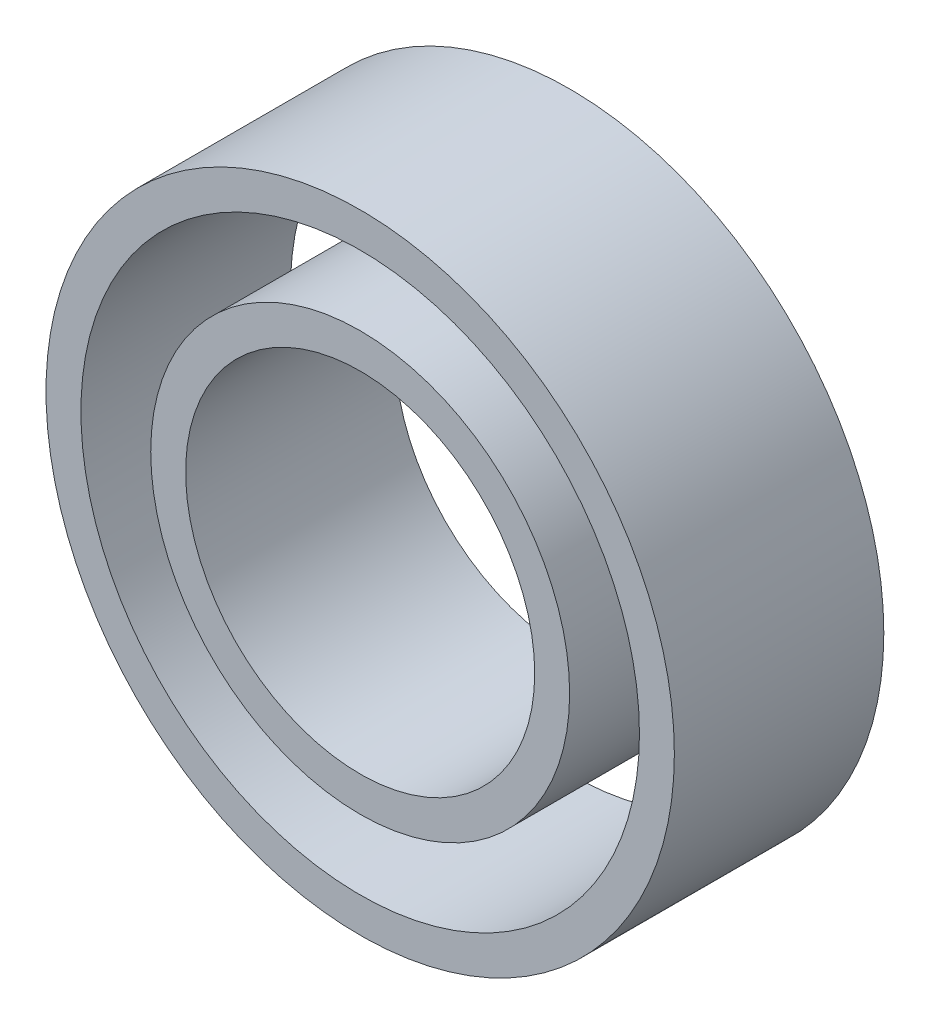
ISO-10303-21;
HEADER;
FILE_DESCRIPTION(('STEP AP214'),'2;1');
FILE_NAME('part.step','',(''),(''),'','','');
FILE_SCHEMA(('AUTOMOTIVE_DESIGN { 1 0 10303 214 1 1 1 1 }'));
ENDSEC;
DATA;
#1=APPLICATION_CONTEXT('core data for automotive mechanical design processes');
#2=APPLICATION_PROTOCOL_DEFINITION('international standard','automotive_design',2000,#1);
#3=PRODUCT_CONTEXT('',#1,'mechanical');
#4=PRODUCT('Part','Part','',(#3));
#5=PRODUCT_RELATED_PRODUCT_CATEGORY('part','',(#4));
#6=PRODUCT_DEFINITION_FORMATION('','',#4);
#7=PRODUCT_DEFINITION_CONTEXT('part definition',#1,'design');
#8=PRODUCT_DEFINITION('design','',#6,#7);
#9=PRODUCT_DEFINITION_SHAPE('','',#8);
#10=(LENGTH_UNIT() NAMED_UNIT(*) SI_UNIT(.MILLI.,.METRE.));
#11=(NAMED_UNIT(*) PLANE_ANGLE_UNIT() SI_UNIT($,.RADIAN.));
#12=(NAMED_UNIT(*) SI_UNIT($,.STERADIAN.) SOLID_ANGLE_UNIT());
#13=UNCERTAINTY_MEASURE_WITH_UNIT(LENGTH_MEASURE(1.E-05),#10,'distance_accuracy_value','');
#14=(GEOMETRIC_REPRESENTATION_CONTEXT(3) GLOBAL_UNCERTAINTY_ASSIGNED_CONTEXT((#13)) GLOBAL_UNIT_ASSIGNED_CONTEXT((#10,
#11,#12)) REPRESENTATION_CONTEXT('',''));
#15=CARTESIAN_POINT('',(0.,0.,0.));
#16=DIRECTION('',(0.,0.,1.));
#17=DIRECTION('',(1.,0.,0.));
#18=AXIS2_PLACEMENT_3D('',#15,#16,#17);
#19=CARTESIAN_POINT('',(0.,0.,-2.5));
#20=DIRECTION('',(0.,0.,1.));
#21=DIRECTION('',(1.,0.,0.));
#22=AXIS2_PLACEMENT_3D('',#19,#20,#21);
#23=CYLINDRICAL_SURFACE('',#22,4.);
#24=CARTESIAN_POINT('',(0.,0.,-4.));
#25=DIRECTION('',(0.,0.,1.));
#26=DIRECTION('',(1.,0.,0.));
#27=AXIS2_PLACEMENT_3D('',#24,#25,#26);
#28=CIRCLE('',#27,4.);
#29=CARTESIAN_POINT('',(4.,0.,-4.));
#30=VERTEX_POINT('',#29);
#31=EDGE_CURVE('P0_E27',#30,#30,#28,.T.);
#32=ORIENTED_EDGE('',*,*,#31,.F.);
#33=EDGE_LOOP('',(#32));
#34=FACE_BOUND('',#33,.T.);
#35=CARTESIAN_POINT('',(0.,0.,-1.));
#36=DIRECTION('',(0.,0.,1.));
#37=DIRECTION('',(1.,0.,0.));
#38=AXIS2_PLACEMENT_3D('',#35,#36,#37);
#39=CIRCLE('',#38,4.);
#40=CARTESIAN_POINT('',(4.,0.,-1.));
#41=VERTEX_POINT('',#40);
#42=EDGE_CURVE('P0_E18',#41,#41,#39,.F.);
#43=ORIENTED_EDGE('',*,*,#42,.F.);
#44=EDGE_LOOP('',(#43));
#45=FACE_BOUND('',#44,.T.);
#46=ADVANCED_FACE('P0_F15',(#34,#45),#23,.F.);
#47=CARTESIAN_POINT('',(4.,0.,-1.));
#48=DIRECTION('',(0.,0.,1.));
#49=DIRECTION('',(1.,0.,0.));
#50=AXIS2_PLACEMENT_3D('',#47,#48,#49);
#51=PLANE('',#50);
#52=ORIENTED_EDGE('',*,*,#42,.T.);
#53=EDGE_LOOP('',(#52));
#54=FACE_BOUND('',#53,.T.);
#55=CARTESIAN_POINT('',(0.,0.,-1.));
#56=DIRECTION('',(0.,0.,1.));
#57=DIRECTION('',(1.,0.,0.));
#58=AXIS2_PLACEMENT_3D('',#55,#56,#57);
#59=CIRCLE('',#58,4.5);
#60=CARTESIAN_POINT('',(4.5,0.,-1.));
#61=VERTEX_POINT('',#60);
#62=EDGE_CURVE('P0_E22',#61,#61,#59,.F.);
#63=ORIENTED_EDGE('',*,*,#62,.F.);
#64=EDGE_LOOP('',(#63));
#65=FACE_BOUND('',#64,.T.);
#66=ADVANCED_FACE('P0_F35',(#54,#65),#51,.T.);
#67=CARTESIAN_POINT('',(4.5,0.,-4.));
#68=DIRECTION('',(0.,0.,-1.));
#69=DIRECTION('',(-1.,0.,0.));
#70=AXIS2_PLACEMENT_3D('',#67,#68,#69);
#71=PLANE('',#70);
#72=ORIENTED_EDGE('',*,*,#31,.T.);
#73=EDGE_LOOP('',(#72));
#74=FACE_BOUND('',#73,.T.);
#75=CARTESIAN_POINT('',(0.,0.,-4.));
#76=DIRECTION('',(0.,0.,1.));
#77=DIRECTION('',(1.,0.,0.));
#78=AXIS2_PLACEMENT_3D('',#75,#76,#77);
#79=CIRCLE('',#78,4.5);
#80=CARTESIAN_POINT('',(4.5,0.,-4.));
#81=VERTEX_POINT('',#80);
#82=EDGE_CURVE('P0_E10',#81,#81,#79,.T.);
#83=ORIENTED_EDGE('',*,*,#82,.F.);
#84=EDGE_LOOP('',(#83));
#85=FACE_BOUND('',#84,.T.);
#86=ADVANCED_FACE('P0_F44',(#74,#85),#71,.T.);
#87=CARTESIAN_POINT('',(0.,0.,-2.5));
#88=DIRECTION('',(0.,0.,1.));
#89=DIRECTION('',(1.,0.,0.));
#90=AXIS2_PLACEMENT_3D('',#87,#88,#89);
#91=CYLINDRICAL_SURFACE('',#90,4.5);
#92=ORIENTED_EDGE('',*,*,#82,.T.);
#93=EDGE_LOOP('',(#92));
#94=FACE_BOUND('',#93,.T.);
#95=ORIENTED_EDGE('',*,*,#62,.T.);
#96=EDGE_LOOP('',(#95));
#97=FACE_BOUND('',#96,.T.);
#98=ADVANCED_FACE('P0_F45',(#94,#97),#91,.T.);
#99=CLOSED_SHELL('',(#46,#66,#86,#98));
#100=MANIFOLD_SOLID_BREP('P0_B1',#99);
#101=CARTESIAN_POINT('',(0.,0.,-2.5));
#102=DIRECTION('',(0.,0.,1.));
#103=DIRECTION('',(1.,0.,0.));
#104=AXIS2_PLACEMENT_3D('',#101,#102,#103);
#105=CYLINDRICAL_SURFACE('',#104,2.5);
#106=CARTESIAN_POINT('',(0.,0.,-4.));
#107=DIRECTION('',(0.,0.,1.));
#108=DIRECTION('',(1.,0.,0.));
#109=AXIS2_PLACEMENT_3D('',#106,#107,#108);
#110=CIRCLE('',#109,2.5);
#111=CARTESIAN_POINT('',(2.5,0.,-4.));
#112=VERTEX_POINT('',#111);
#113=EDGE_CURVE('P1_E27',#112,#112,#110,.T.);
#114=ORIENTED_EDGE('',*,*,#113,.F.);
#115=EDGE_LOOP('',(#114));
#116=FACE_BOUND('',#115,.T.);
#117=CARTESIAN_POINT('',(0.,0.,-1.));
#118=DIRECTION('',(0.,0.,1.));
#119=DIRECTION('',(1.,0.,0.));
#120=AXIS2_PLACEMENT_3D('',#117,#118,#119);
#121=CIRCLE('',#120,2.5);
#122=CARTESIAN_POINT('',(2.5,0.,-1.));
#123=VERTEX_POINT('',#122);
#124=EDGE_CURVE('P1_E18',#123,#123,#121,.F.);
#125=ORIENTED_EDGE('',*,*,#124,.F.);
#126=EDGE_LOOP('',(#125));
#127=FACE_BOUND('',#126,.T.);
#128=ADVANCED_FACE('P1_F15',(#116,#127),#105,.F.);
#129=CARTESIAN_POINT('',(2.5,0.,-1.));
#130=DIRECTION('',(0.,0.,1.));
#131=DIRECTION('',(1.,0.,0.));
#132=AXIS2_PLACEMENT_3D('',#129,#130,#131);
#133=PLANE('',#132);
#134=ORIENTED_EDGE('',*,*,#124,.T.);
#135=EDGE_LOOP('',(#134));
#136=FACE_BOUND('',#135,.T.);
#137=CARTESIAN_POINT('',(0.,0.,-1.));
#138=DIRECTION('',(0.,0.,1.));
#139=DIRECTION('',(1.,0.,0.));
#140=AXIS2_PLACEMENT_3D('',#137,#138,#139);
#141=CIRCLE('',#140,3.);
#142=CARTESIAN_POINT('',(3.,0.,-1.));
#143=VERTEX_POINT('',#142);
#144=EDGE_CURVE('P1_E22',#143,#143,#141,.F.);
#145=ORIENTED_EDGE('',*,*,#144,.F.);
#146=EDGE_LOOP('',(#145));
#147=FACE_BOUND('',#146,.T.);
#148=ADVANCED_FACE('P1_F35',(#136,#147),#133,.T.);
#149=CARTESIAN_POINT('',(3.,0.,-4.));
#150=DIRECTION('',(0.,0.,-1.));
#151=DIRECTION('',(-1.,0.,0.));
#152=AXIS2_PLACEMENT_3D('',#149,#150,#151);
#153=PLANE('',#152);
#154=ORIENTED_EDGE('',*,*,#113,.T.);
#155=EDGE_LOOP('',(#154));
#156=FACE_BOUND('',#155,.T.);
#157=CARTESIAN_POINT('',(0.,0.,-4.));
#158=DIRECTION('',(0.,0.,1.));
#159=DIRECTION('',(1.,0.,0.));
#160=AXIS2_PLACEMENT_3D('',#157,#158,#159);
#161=CIRCLE('',#160,3.);
#162=CARTESIAN_POINT('',(3.,0.,-4.));
#163=VERTEX_POINT('',#162);
#164=EDGE_CURVE('P1_E10',#163,#163,#161,.T.);
#165=ORIENTED_EDGE('',*,*,#164,.F.);
#166=EDGE_LOOP('',(#165));
#167=FACE_BOUND('',#166,.T.);
#168=ADVANCED_FACE('P1_F44',(#156,#167),#153,.T.);
#169=CARTESIAN_POINT('',(0.,0.,-2.5));
#170=DIRECTION('',(0.,0.,1.));
#171=DIRECTION('',(1.,0.,0.));
#172=AXIS2_PLACEMENT_3D('',#169,#170,#171);
#173=CYLINDRICAL_SURFACE('',#172,3.);
#174=ORIENTED_EDGE('',*,*,#164,.T.);
#175=EDGE_LOOP('',(#174));
#176=FACE_BOUND('',#175,.T.);
#177=ORIENTED_EDGE('',*,*,#144,.T.);
#178=EDGE_LOOP('',(#177));
#179=FACE_BOUND('',#178,.T.);
#180=ADVANCED_FACE('P1_F45',(#176,#179),#173,.T.);
#181=CLOSED_SHELL('',(#128,#148,#168,#180));
#182=MANIFOLD_SOLID_BREP('P1_B1',#181);
#183=ADVANCED_BREP_SHAPE_REPRESENTATION('',(#18,#100,#182),#14);
#184=SHAPE_DEFINITION_REPRESENTATION(#9,#183);
ENDSEC;
END-ISO-10303-21;
